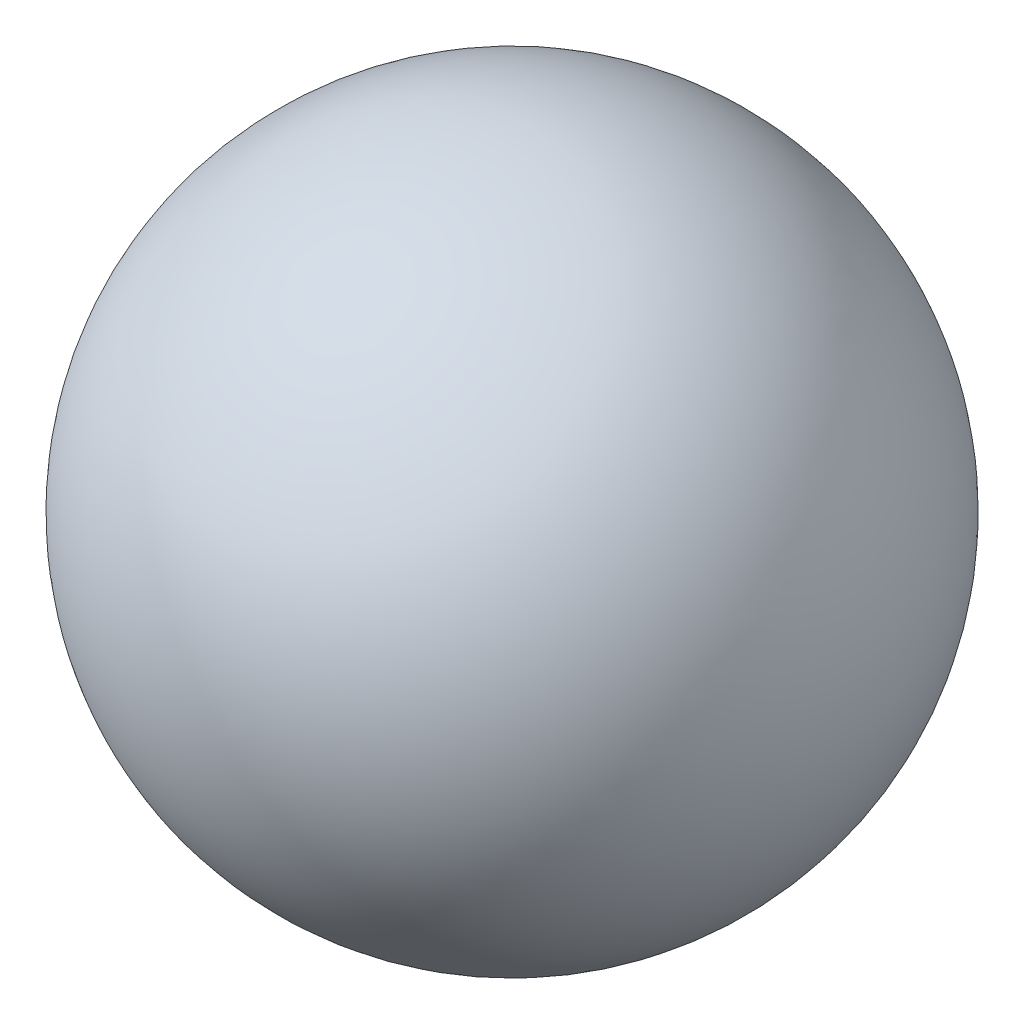
ISO-10303-21;
HEADER;
FILE_DESCRIPTION(('STEP AP214'),'2;1');
FILE_NAME('part.step','',(''),(''),'','','');
FILE_SCHEMA(('AUTOMOTIVE_DESIGN { 1 0 10303 214 1 1 1 1 }'));
ENDSEC;
DATA;
#1=APPLICATION_CONTEXT('core data for automotive mechanical design processes');
#2=APPLICATION_PROTOCOL_DEFINITION('international standard','automotive_design',2000,#1);
#3=PRODUCT_CONTEXT('',#1,'mechanical');
#4=PRODUCT('Part','Part','',(#3));
#5=PRODUCT_RELATED_PRODUCT_CATEGORY('part','',(#4));
#6=PRODUCT_DEFINITION_FORMATION('','',#4);
#7=PRODUCT_DEFINITION_CONTEXT('part definition',#1,'design');
#8=PRODUCT_DEFINITION('design','',#6,#7);
#9=PRODUCT_DEFINITION_SHAPE('','',#8);
#10=(LENGTH_UNIT() NAMED_UNIT(*) SI_UNIT(.MILLI.,.METRE.));
#11=(NAMED_UNIT(*) PLANE_ANGLE_UNIT() SI_UNIT($,.RADIAN.));
#12=(NAMED_UNIT(*) SI_UNIT($,.STERADIAN.) SOLID_ANGLE_UNIT());
#13=UNCERTAINTY_MEASURE_WITH_UNIT(LENGTH_MEASURE(1.E-05),#10,'distance_accuracy_value','');
#14=(GEOMETRIC_REPRESENTATION_CONTEXT(3) GLOBAL_UNCERTAINTY_ASSIGNED_CONTEXT((#13)) GLOBAL_UNIT_ASSIGNED_CONTEXT((#10,
#11,#12)) REPRESENTATION_CONTEXT('',''));
#15=CARTESIAN_POINT('',(0.,0.,0.));
#16=DIRECTION('',(0.,0.,1.));
#17=DIRECTION('',(1.,0.,0.));
#18=AXIS2_PLACEMENT_3D('',#15,#16,#17);
#19=CARTESIAN_POINT('',(0.,0.,0.));
#20=DIRECTION('',(0.,0.,1.));
#21=DIRECTION('',(-1.,0.,0.));
#22=AXIS2_PLACEMENT_3D('',#19,#20,#21);
#23=SPHERICAL_SURFACE('',#22,28.5);
#24=CARTESIAN_POINT('',(0.,0.,28.5));
#25=VERTEX_POINT('',#24);
#26=VERTEX_LOOP('',#25);
#27=FACE_BOUND('',#26,.T.);
#28=ADVANCED_FACE('F34',(#27),#23,.T.);
#29=CLOSED_SHELL('',(#28));
#30=MANIFOLD_SOLID_BREP('B2',#29);
#31=ADVANCED_BREP_SHAPE_REPRESENTATION('',(#18,#30),#14);
#32=SHAPE_DEFINITION_REPRESENTATION(#9,#31);
ENDSEC;
END-ISO-10303-21;
